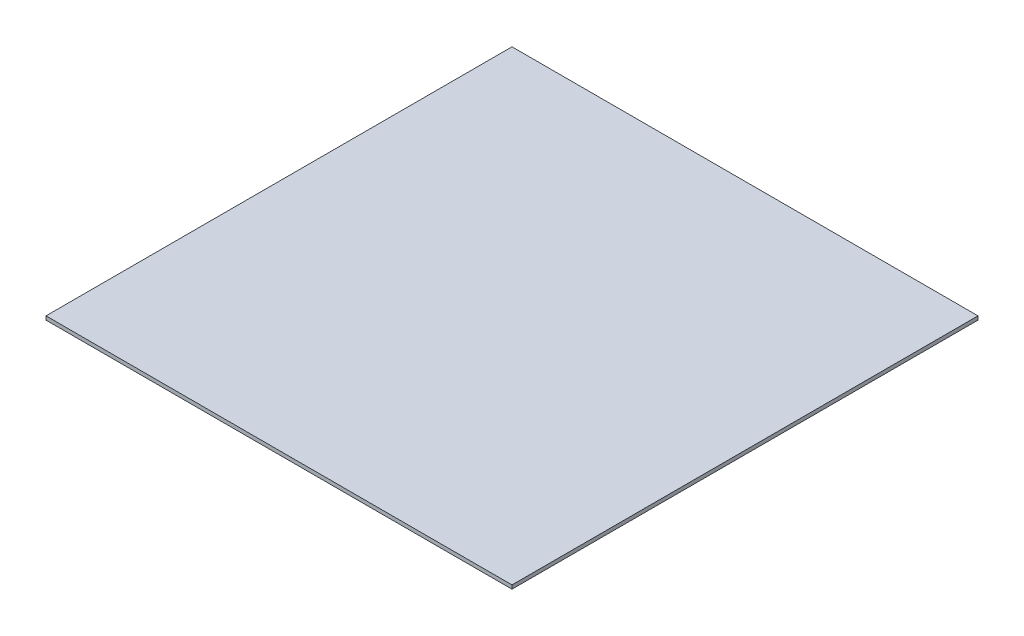
ISO-10303-21;
HEADER;
FILE_DESCRIPTION(('STEP AP214'),'2;1');
FILE_NAME('part.step','',(''),(''),'','','');
FILE_SCHEMA(('AUTOMOTIVE_DESIGN { 1 0 10303 214 1 1 1 1 }'));
ENDSEC;
DATA;
#1=APPLICATION_CONTEXT('core data for automotive mechanical design processes');
#2=APPLICATION_PROTOCOL_DEFINITION('international standard','automotive_design',2000,#1);
#3=PRODUCT_CONTEXT('',#1,'mechanical');
#4=PRODUCT('Part','Part','',(#3));
#5=PRODUCT_RELATED_PRODUCT_CATEGORY('part','',(#4));
#6=PRODUCT_DEFINITION_FORMATION('','',#4);
#7=PRODUCT_DEFINITION_CONTEXT('part definition',#1,'design');
#8=PRODUCT_DEFINITION('design','',#6,#7);
#9=PRODUCT_DEFINITION_SHAPE('','',#8);
#10=(LENGTH_UNIT() NAMED_UNIT(*) SI_UNIT(.MILLI.,.METRE.));
#11=(NAMED_UNIT(*) PLANE_ANGLE_UNIT() SI_UNIT($,.RADIAN.));
#12=(NAMED_UNIT(*) SI_UNIT($,.STERADIAN.) SOLID_ANGLE_UNIT());
#13=UNCERTAINTY_MEASURE_WITH_UNIT(LENGTH_MEASURE(1.E-05),#10,'distance_accuracy_value','');
#14=(GEOMETRIC_REPRESENTATION_CONTEXT(3) GLOBAL_UNCERTAINTY_ASSIGNED_CONTEXT((#13)) GLOBAL_UNIT_ASSIGNED_CONTEXT((#10,
#11,#12)) REPRESENTATION_CONTEXT('',''));
#15=CARTESIAN_POINT('',(0.,0.,0.));
#16=DIRECTION('',(0.,0.,1.));
#17=DIRECTION('',(1.,0.,0.));
#18=AXIS2_PLACEMENT_3D('',#15,#16,#17);
#19=CARTESIAN_POINT('',(0.,0.,0.));
#20=DIRECTION('',(0.,-1.,0.));
#21=DIRECTION('',(0.,0.,-1.));
#22=AXIS2_PLACEMENT_3D('',#19,#20,#21);
#23=PLANE('',#22);
#24=DIRECTION('',(0.,0.,-1.));
#25=VECTOR('',#24,1.);
#26=CARTESIAN_POINT('',(250.,0.,250.));
#27=LINE('',#26,#25);
#28=CARTESIAN_POINT('',(250.,0.,250.));
#29=VERTEX_POINT('',#28);
#30=CARTESIAN_POINT('',(250.,0.,-250.));
#31=VERTEX_POINT('',#30);
#32=EDGE_CURVE('E132',#29,#31,#27,.T.);
#33=ORIENTED_EDGE('',*,*,#32,.F.);
#34=DIRECTION('',(1.,0.,0.));
#35=VECTOR('',#34,1.);
#36=CARTESIAN_POINT('',(-250.,0.,250.));
#37=LINE('',#36,#35);
#38=CARTESIAN_POINT('',(-250.,0.,250.));
#39=VERTEX_POINT('',#38);
#40=EDGE_CURVE('E78',#39,#29,#37,.T.);
#41=ORIENTED_EDGE('',*,*,#40,.F.);
#42=DIRECTION('',(0.,0.,1.));
#43=VECTOR('',#42,1.);
#44=CARTESIAN_POINT('',(-250.,0.,250.));
#45=LINE('',#44,#43);
#46=CARTESIAN_POINT('',(-250.,0.,-250.));
#47=VERTEX_POINT('',#46);
#48=EDGE_CURVE('E148',#47,#39,#45,.T.);
#49=ORIENTED_EDGE('',*,*,#48,.F.);
#50=DIRECTION('',(-1.,0.,0.));
#51=VECTOR('',#50,1.);
#52=CARTESIAN_POINT('',(-250.,0.,-250.));
#53=LINE('',#52,#51);
#54=EDGE_CURVE('E135',#31,#47,#53,.T.);
#55=ORIENTED_EDGE('',*,*,#54,.F.);
#56=EDGE_LOOP('',(#33,#41,#49,#55));
#57=FACE_BOUND('',#56,.T.);
#58=DIRECTION('',(-1.,0.,0.));
#59=VECTOR('',#58,1.);
#60=CARTESIAN_POINT('',(-246.,0.,246.));
#61=LINE('',#60,#59);
#62=CARTESIAN_POINT('',(246.,0.,246.));
#63=VERTEX_POINT('',#62);
#64=CARTESIAN_POINT('',(-246.,0.,246.));
#65=VERTEX_POINT('',#64);
#66=EDGE_CURVE('E263',#63,#65,#61,.T.);
#67=ORIENTED_EDGE('',*,*,#66,.F.);
#68=DIRECTION('',(0.,0.,1.));
#69=VECTOR('',#68,1.);
#70=CARTESIAN_POINT('',(246.,0.,-246.));
#71=LINE('',#70,#69);
#72=CARTESIAN_POINT('',(246.,0.,-246.));
#73=VERTEX_POINT('',#72);
#74=EDGE_CURVE('E130',#73,#63,#71,.T.);
#75=ORIENTED_EDGE('',*,*,#74,.F.);
#76=DIRECTION('',(1.,0.,0.));
#77=VECTOR('',#76,1.);
#78=CARTESIAN_POINT('',(-246.,0.,-246.));
#79=LINE('',#78,#77);
#80=CARTESIAN_POINT('',(-246.,0.,-246.));
#81=VERTEX_POINT('',#80);
#82=EDGE_CURVE('E126',#81,#73,#79,.T.);
#83=ORIENTED_EDGE('',*,*,#82,.F.);
#84=DIRECTION('',(0.,0.,-1.));
#85=VECTOR('',#84,1.);
#86=CARTESIAN_POINT('',(-246.,0.,-246.));
#87=LINE('',#86,#85);
#88=EDGE_CURVE('E260',#65,#81,#87,.T.);
#89=ORIENTED_EDGE('',*,*,#88,.F.);
#90=EDGE_LOOP('',(#67,#75,#83,#89));
#91=FACE_BOUND('',#90,.T.);
#92=ADVANCED_FACE('F33',(#57,#91),#23,.T.);
#93=CARTESIAN_POINT('',(250.,4.,250.));
#94=DIRECTION('',(-1.,0.,0.));
#95=DIRECTION('',(0.,0.,1.));
#96=AXIS2_PLACEMENT_3D('',#93,#94,#95);
#97=PLANE('',#96);
#98=ORIENTED_EDGE('',*,*,#32,.T.);
#99=DIRECTION('',(0.,-1.,0.));
#100=VECTOR('',#99,1.);
#101=CARTESIAN_POINT('',(250.,4.,-250.));
#102=LINE('',#101,#100);
#103=CARTESIAN_POINT('',(250.,4.,-250.));
#104=VERTEX_POINT('',#103);
#105=EDGE_CURVE('E11',#104,#31,#102,.T.);
#106=ORIENTED_EDGE('',*,*,#105,.F.);
#107=DIRECTION('',(0.,0.,-1.));
#108=VECTOR('',#107,1.);
#109=CARTESIAN_POINT('',(250.,4.,250.));
#110=LINE('',#109,#108);
#111=CARTESIAN_POINT('',(250.,4.,250.));
#112=VERTEX_POINT('',#111);
#113=EDGE_CURVE('E140',#112,#104,#110,.T.);
#114=ORIENTED_EDGE('',*,*,#113,.F.);
#115=DIRECTION('',(0.,-1.,0.));
#116=VECTOR('',#115,1.);
#117=CARTESIAN_POINT('',(250.,4.,250.));
#118=LINE('',#117,#116);
#119=EDGE_CURVE('E145',#112,#29,#118,.T.);
#120=ORIENTED_EDGE('',*,*,#119,.T.);
#121=EDGE_LOOP('',(#98,#106,#114,#120));
#122=FACE_BOUND('',#121,.T.);
#123=ADVANCED_FACE('F35',(#122),#97,.F.);
#124=CARTESIAN_POINT('',(-250.,4.,-250.));
#125=DIRECTION('',(0.,0.,1.));
#126=DIRECTION('',(1.,0.,0.));
#127=AXIS2_PLACEMENT_3D('',#124,#125,#126);
#128=PLANE('',#127);
#129=ORIENTED_EDGE('',*,*,#54,.T.);
#130=DIRECTION('',(0.,-1.,0.));
#131=VECTOR('',#130,1.);
#132=CARTESIAN_POINT('',(-250.,4.,-250.));
#133=LINE('',#132,#131);
#134=CARTESIAN_POINT('',(-250.,4.,-250.));
#135=VERTEX_POINT('',#134);
#136=EDGE_CURVE('E41',#135,#47,#133,.T.);
#137=ORIENTED_EDGE('',*,*,#136,.F.);
#138=DIRECTION('',(-1.,0.,0.));
#139=VECTOR('',#138,1.);
#140=CARTESIAN_POINT('',(-250.,4.,-250.));
#141=LINE('',#140,#139);
#142=EDGE_CURVE('E85',#104,#135,#141,.T.);
#143=ORIENTED_EDGE('',*,*,#142,.F.);
#144=ORIENTED_EDGE('',*,*,#105,.T.);
#145=EDGE_LOOP('',(#129,#137,#143,#144));
#146=FACE_BOUND('',#145,.T.);
#147=ADVANCED_FACE('F174',(#146),#128,.F.);
#148=CARTESIAN_POINT('',(-250.,4.,250.));
#149=DIRECTION('',(1.,0.,0.));
#150=DIRECTION('',(0.,0.,-1.));
#151=AXIS2_PLACEMENT_3D('',#148,#149,#150);
#152=PLANE('',#151);
#153=ORIENTED_EDGE('',*,*,#48,.T.);
#154=DIRECTION('',(0.,-1.,0.));
#155=VECTOR('',#154,1.);
#156=CARTESIAN_POINT('',(-250.,4.,250.));
#157=LINE('',#156,#155);
#158=CARTESIAN_POINT('',(-250.,4.,250.));
#159=VERTEX_POINT('',#158);
#160=EDGE_CURVE('E152',#159,#39,#157,.T.);
#161=ORIENTED_EDGE('',*,*,#160,.F.);
#162=DIRECTION('',(0.,0.,1.));
#163=VECTOR('',#162,1.);
#164=CARTESIAN_POINT('',(-250.,4.,250.));
#165=LINE('',#164,#163);
#166=EDGE_CURVE('E143',#135,#159,#165,.T.);
#167=ORIENTED_EDGE('',*,*,#166,.F.);
#168=ORIENTED_EDGE('',*,*,#136,.T.);
#169=EDGE_LOOP('',(#153,#161,#167,#168));
#170=FACE_BOUND('',#169,.T.);
#171=ADVANCED_FACE('F157',(#170),#152,.F.);
#172=CARTESIAN_POINT('',(-250.,4.,250.));
#173=DIRECTION('',(0.,0.,-1.));
#174=DIRECTION('',(-1.,0.,0.));
#175=AXIS2_PLACEMENT_3D('',#172,#173,#174);
#176=PLANE('',#175);
#177=ORIENTED_EDGE('',*,*,#40,.T.);
#178=ORIENTED_EDGE('',*,*,#119,.F.);
#179=DIRECTION('',(1.,0.,0.));
#180=VECTOR('',#179,1.);
#181=CARTESIAN_POINT('',(-250.,4.,250.));
#182=LINE('',#181,#180);
#183=EDGE_CURVE('E57',#159,#112,#182,.T.);
#184=ORIENTED_EDGE('',*,*,#183,.F.);
#185=ORIENTED_EDGE('',*,*,#160,.T.);
#186=EDGE_LOOP('',(#177,#178,#184,#185));
#187=FACE_BOUND('',#186,.T.);
#188=ADVANCED_FACE('F165',(#187),#176,.F.);
#189=CARTESIAN_POINT('',(0.,4.,0.));
#190=DIRECTION('',(0.,-1.,0.));
#191=DIRECTION('',(0.,0.,-1.));
#192=AXIS2_PLACEMENT_3D('',#189,#190,#191);
#193=PLANE('',#192);
#194=ORIENTED_EDGE('',*,*,#113,.T.);
#195=ORIENTED_EDGE('',*,*,#142,.T.);
#196=ORIENTED_EDGE('',*,*,#166,.T.);
#197=ORIENTED_EDGE('',*,*,#183,.T.);
#198=EDGE_LOOP('',(#194,#195,#196,#197));
#199=FACE_BOUND('',#198,.T.);
#200=ADVANCED_FACE('F167',(#199),#193,.F.);
#201=CARTESIAN_POINT('',(246.,-4.,-246.));
#202=DIRECTION('',(-1.,0.,0.));
#203=DIRECTION('',(0.,0.,1.));
#204=AXIS2_PLACEMENT_3D('',#201,#202,#203);
#205=PLANE('',#204);
#206=ORIENTED_EDGE('',*,*,#74,.T.);
#207=DIRECTION('',(0.,1.,0.));
#208=VECTOR('',#207,1.);
#209=CARTESIAN_POINT('',(246.,-4.,246.));
#210=LINE('',#209,#208);
#211=CARTESIAN_POINT('',(246.,-4.,246.));
#212=VERTEX_POINT('',#211);
#213=EDGE_CURVE('E111',#212,#63,#210,.T.);
#214=ORIENTED_EDGE('',*,*,#213,.F.);
#215=DIRECTION('',(0.,0.,1.));
#216=VECTOR('',#215,1.);
#217=CARTESIAN_POINT('',(246.,-4.,-246.));
#218=LINE('',#217,#216);
#219=CARTESIAN_POINT('',(246.,-4.,-246.));
#220=VERTEX_POINT('',#219);
#221=EDGE_CURVE('E118',#220,#212,#218,.T.);
#222=ORIENTED_EDGE('',*,*,#221,.F.);
#223=DIRECTION('',(0.,1.,0.));
#224=VECTOR('',#223,1.);
#225=CARTESIAN_POINT('',(246.,-4.,-246.));
#226=LINE('',#225,#224);
#227=EDGE_CURVE('E258',#220,#73,#226,.T.);
#228=ORIENTED_EDGE('',*,*,#227,.T.);
#229=EDGE_LOOP('',(#206,#214,#222,#228));
#230=FACE_BOUND('',#229,.T.);
#231=ADVANCED_FACE('F128',(#230),#205,.F.);
#232=CARTESIAN_POINT('',(-246.,-4.,246.));
#233=DIRECTION('',(0.,0.,-1.));
#234=DIRECTION('',(-1.,0.,0.));
#235=AXIS2_PLACEMENT_3D('',#232,#233,#234);
#236=PLANE('',#235);
#237=ORIENTED_EDGE('',*,*,#66,.T.);
#238=DIRECTION('',(0.,1.,0.));
#239=VECTOR('',#238,1.);
#240=CARTESIAN_POINT('',(-246.,-4.,246.));
#241=LINE('',#240,#239);
#242=CARTESIAN_POINT('',(-246.,-4.,246.));
#243=VERTEX_POINT('',#242);
#244=EDGE_CURVE('E114',#243,#65,#241,.T.);
#245=ORIENTED_EDGE('',*,*,#244,.F.);
#246=DIRECTION('',(-1.,0.,0.));
#247=VECTOR('',#246,1.);
#248=CARTESIAN_POINT('',(-246.,-4.,246.));
#249=LINE('',#248,#247);
#250=EDGE_CURVE('E107',#212,#243,#249,.T.);
#251=ORIENTED_EDGE('',*,*,#250,.F.);
#252=ORIENTED_EDGE('',*,*,#213,.T.);
#253=EDGE_LOOP('',(#237,#245,#251,#252));
#254=FACE_BOUND('',#253,.T.);
#255=ADVANCED_FACE('F109',(#254),#236,.F.);
#256=CARTESIAN_POINT('',(-246.,-4.,-246.));
#257=DIRECTION('',(1.,0.,0.));
#258=DIRECTION('',(0.,0.,-1.));
#259=AXIS2_PLACEMENT_3D('',#256,#257,#258);
#260=PLANE('',#259);
#261=ORIENTED_EDGE('',*,*,#88,.T.);
#262=DIRECTION('',(0.,1.,0.));
#263=VECTOR('',#262,1.);
#264=CARTESIAN_POINT('',(-246.,-4.,-246.));
#265=LINE('',#264,#263);
#266=CARTESIAN_POINT('',(-246.,-4.,-246.));
#267=VERTEX_POINT('',#266);
#268=EDGE_CURVE('E48',#267,#81,#265,.T.);
#269=ORIENTED_EDGE('',*,*,#268,.F.);
#270=DIRECTION('',(0.,0.,-1.));
#271=VECTOR('',#270,1.);
#272=CARTESIAN_POINT('',(-246.,-4.,-246.));
#273=LINE('',#272,#271);
#274=EDGE_CURVE('E117',#243,#267,#273,.T.);
#275=ORIENTED_EDGE('',*,*,#274,.F.);
#276=ORIENTED_EDGE('',*,*,#244,.T.);
#277=EDGE_LOOP('',(#261,#269,#275,#276));
#278=FACE_BOUND('',#277,.T.);
#279=ADVANCED_FACE('F186',(#278),#260,.F.);
#280=CARTESIAN_POINT('',(-246.,-4.,-246.));
#281=DIRECTION('',(0.,0.,1.));
#282=DIRECTION('',(1.,0.,0.));
#283=AXIS2_PLACEMENT_3D('',#280,#281,#282);
#284=PLANE('',#283);
#285=ORIENTED_EDGE('',*,*,#82,.T.);
#286=ORIENTED_EDGE('',*,*,#227,.F.);
#287=DIRECTION('',(1.,0.,0.));
#288=VECTOR('',#287,1.);
#289=CARTESIAN_POINT('',(-246.,-4.,-246.));
#290=LINE('',#289,#288);
#291=EDGE_CURVE('E122',#267,#220,#290,.T.);
#292=ORIENTED_EDGE('',*,*,#291,.F.);
#293=ORIENTED_EDGE('',*,*,#268,.T.);
#294=EDGE_LOOP('',(#285,#286,#292,#293));
#295=FACE_BOUND('',#294,.T.);
#296=ADVANCED_FACE('F189',(#295),#284,.F.);
#297=CARTESIAN_POINT('',(0.,-4.,0.));
#298=DIRECTION('',(0.,1.,0.));
#299=DIRECTION('',(0.,0.,1.));
#300=AXIS2_PLACEMENT_3D('',#297,#298,#299);
#301=PLANE('',#300);
#302=ORIENTED_EDGE('',*,*,#221,.T.);
#303=ORIENTED_EDGE('',*,*,#250,.T.);
#304=ORIENTED_EDGE('',*,*,#274,.T.);
#305=ORIENTED_EDGE('',*,*,#291,.T.);
#306=EDGE_LOOP('',(#302,#303,#304,#305));
#307=FACE_BOUND('',#306,.T.);
#308=ADVANCED_FACE('F121',(#307),#301,.F.);
#309=CLOSED_SHELL('',(#92,#123,#147,#171,#188,#200,#231,#255,#279,#296,#308));
#310=MANIFOLD_SOLID_BREP('B2',#309);
#311=ADVANCED_BREP_SHAPE_REPRESENTATION('',(#18,#310),#14);
#312=SHAPE_DEFINITION_REPRESENTATION(#9,#311);
ENDSEC;
END-ISO-10303-21;
